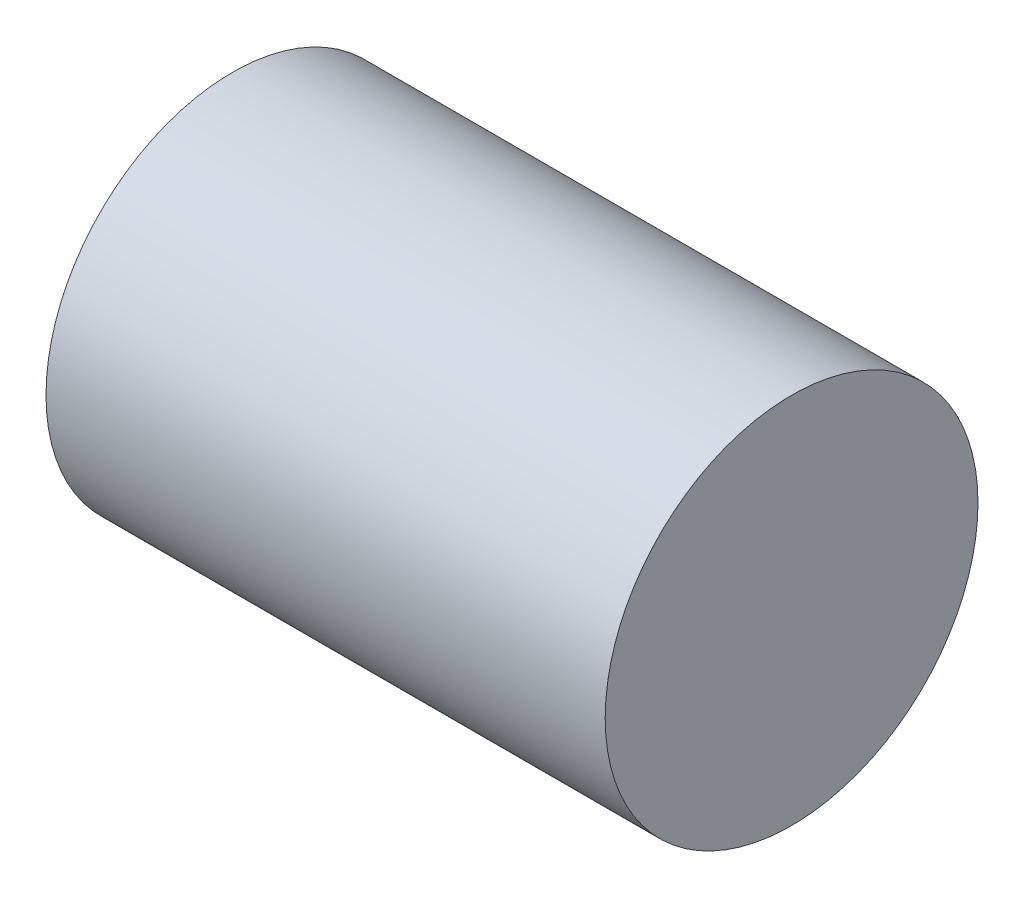
ISO-10303-21;
HEADER;
FILE_DESCRIPTION(('STEP AP214'),'2;1');
FILE_NAME('part.step','',(''),(''),'','','');
FILE_SCHEMA(('AUTOMOTIVE_DESIGN { 1 0 10303 214 1 1 1 1 }'));
ENDSEC;
DATA;
#1=APPLICATION_CONTEXT('core data for automotive mechanical design processes');
#2=APPLICATION_PROTOCOL_DEFINITION('international standard','automotive_design',2000,#1);
#3=PRODUCT_CONTEXT('',#1,'mechanical');
#4=PRODUCT('Part','Part','',(#3));
#5=PRODUCT_RELATED_PRODUCT_CATEGORY('part','',(#4));
#6=PRODUCT_DEFINITION_FORMATION('','',#4);
#7=PRODUCT_DEFINITION_CONTEXT('part definition',#1,'design');
#8=PRODUCT_DEFINITION('design','',#6,#7);
#9=PRODUCT_DEFINITION_SHAPE('','',#8);
#10=(LENGTH_UNIT() NAMED_UNIT(*) SI_UNIT(.MILLI.,.METRE.));
#11=(NAMED_UNIT(*) PLANE_ANGLE_UNIT() SI_UNIT($,.RADIAN.));
#12=(NAMED_UNIT(*) SI_UNIT($,.STERADIAN.) SOLID_ANGLE_UNIT());
#13=UNCERTAINTY_MEASURE_WITH_UNIT(LENGTH_MEASURE(1.E-05),#10,'distance_accuracy_value','');
#14=(GEOMETRIC_REPRESENTATION_CONTEXT(3) GLOBAL_UNCERTAINTY_ASSIGNED_CONTEXT((#13)) GLOBAL_UNIT_ASSIGNED_CONTEXT((#10,
#11,#12)) REPRESENTATION_CONTEXT('',''));
#15=CARTESIAN_POINT('',(0.,0.,0.));
#16=DIRECTION('',(0.,0.,1.));
#17=DIRECTION('',(1.,0.,0.));
#18=AXIS2_PLACEMENT_3D('',#15,#16,#17);
#19=CARTESIAN_POINT('',(38.1,0.,0.));
#20=DIRECTION('',(-1.,0.,0.));
#21=DIRECTION('',(0.,0.,1.));
#22=AXIS2_PLACEMENT_3D('',#19,#20,#21);
#23=CYLINDRICAL_SURFACE('',#22,12.7);
#24=CARTESIAN_POINT('',(38.1,0.,0.));
#25=DIRECTION('',(1.,0.,0.));
#26=DIRECTION('',(0.,0.,-1.));
#27=AXIS2_PLACEMENT_3D('',#24,#25,#26);
#28=CIRCLE('',#27,12.7);
#29=CARTESIAN_POINT('',(38.1,0.,12.7));
#30=VERTEX_POINT('',#29);
#31=EDGE_CURVE('E10',#30,#30,#28,.T.);
#32=CARTESIAN_POINT('',(0.,0.,0.));
#33=DIRECTION('',(1.,0.,0.));
#34=DIRECTION('',(0.,0.,-1.));
#35=AXIS2_PLACEMENT_3D('',#32,#33,#34);
#36=CIRCLE('',#35,12.7);
#37=CARTESIAN_POINT('',(0.,0.,12.7));
#38=VERTEX_POINT('',#37);
#39=EDGE_CURVE('E40',#38,#38,#36,.T.);
#40=CARTESIAN_POINT('',(38.1,0.,12.7));
#41=CARTESIAN_POINT('',(37.703125,0.,12.7));
#42=CARTESIAN_POINT('',(37.30625,0.,12.7));
#43=CARTESIAN_POINT('',(36.5125,0.,12.7));
#44=CARTESIAN_POINT('',(36.115625,0.,12.7));
#45=CARTESIAN_POINT('',(35.321875,0.,12.7));
#46=CARTESIAN_POINT('',(34.925,0.,12.7));
#47=CARTESIAN_POINT('',(34.13125,0.,12.7));
#48=CARTESIAN_POINT('',(33.734375,0.,12.7));
#49=CARTESIAN_POINT('',(32.940625,0.,12.7));
#50=CARTESIAN_POINT('',(32.54375,0.,12.7));
#51=CARTESIAN_POINT('',(31.75,0.,12.7));
#52=CARTESIAN_POINT('',(31.353125,0.,12.7));
#53=CARTESIAN_POINT('',(30.559375,0.,12.7));
#54=CARTESIAN_POINT('',(30.1625,0.,12.7));
#55=CARTESIAN_POINT('',(29.36875,0.,12.7));
#56=CARTESIAN_POINT('',(28.971875,0.,12.7));
#57=CARTESIAN_POINT('',(28.178125,0.,12.7));
#58=CARTESIAN_POINT('',(27.78125,0.,12.7));
#59=CARTESIAN_POINT('',(26.9875,0.,12.7));
#60=CARTESIAN_POINT('',(26.590625,0.,12.7));
#61=CARTESIAN_POINT('',(25.796875,0.,12.7));
#62=CARTESIAN_POINT('',(25.4,0.,12.7));
#63=CARTESIAN_POINT('',(24.60625,0.,12.7));
#64=CARTESIAN_POINT('',(24.209375,0.,12.7));
#65=CARTESIAN_POINT('',(23.415625,0.,12.7));
#66=CARTESIAN_POINT('',(23.01875,0.,12.7));
#67=CARTESIAN_POINT('',(22.225,0.,12.7));
#68=CARTESIAN_POINT('',(21.828125,0.,12.7));
#69=CARTESIAN_POINT('',(21.034375,0.,12.7));
#70=CARTESIAN_POINT('',(20.6375,0.,12.7));
#71=CARTESIAN_POINT('',(19.84375,0.,12.7));
#72=CARTESIAN_POINT('',(19.446875,0.,12.7));
#73=CARTESIAN_POINT('',(18.653125,0.,12.7));
#74=CARTESIAN_POINT('',(18.25625,0.,12.7));
#75=CARTESIAN_POINT('',(17.4625,0.,12.7));
#76=CARTESIAN_POINT('',(17.065625,0.,12.7));
#77=CARTESIAN_POINT('',(16.271875,0.,12.7));
#78=CARTESIAN_POINT('',(15.875,0.,12.7));
#79=CARTESIAN_POINT('',(15.08125,0.,12.7));
#80=CARTESIAN_POINT('',(14.684375,0.,12.7));
#81=CARTESIAN_POINT('',(13.890625,0.,12.7));
#82=CARTESIAN_POINT('',(13.49375,0.,12.7));
#83=CARTESIAN_POINT('',(12.7,0.,12.7));
#84=CARTESIAN_POINT('',(12.303125,0.,12.7));
#85=CARTESIAN_POINT('',(11.509375,0.,12.7));
#86=CARTESIAN_POINT('',(11.1125,0.,12.7));
#87=CARTESIAN_POINT('',(10.31875,0.,12.7));
#88=CARTESIAN_POINT('',(9.92187499999999,0.,12.7));
#89=CARTESIAN_POINT('',(9.128125,0.,12.7));
#90=CARTESIAN_POINT('',(8.73124999999999,0.,12.7));
#91=CARTESIAN_POINT('',(7.93749999999999,0.,12.7));
#92=CARTESIAN_POINT('',(7.54062499999999,0.,12.7));
#93=CARTESIAN_POINT('',(6.746875,0.,12.7));
#94=CARTESIAN_POINT('',(6.35,0.,12.7));
#95=CARTESIAN_POINT('',(5.55625,0.,12.7));
#96=CARTESIAN_POINT('',(5.159375,0.,12.7));
#97=CARTESIAN_POINT('',(4.365625,0.,12.7));
#98=CARTESIAN_POINT('',(3.96875,0.,12.7));
#99=CARTESIAN_POINT('',(3.175,0.,12.7));
#100=CARTESIAN_POINT('',(2.778125,0.,12.7));
#101=CARTESIAN_POINT('',(1.984375,0.,12.7));
#102=CARTESIAN_POINT('',(1.5875,0.,12.7));
#103=CARTESIAN_POINT('',(0.79375,0.,12.7));
#104=CARTESIAN_POINT('',(0.396875,0.,12.7));
#105=CARTESIAN_POINT('',(0.,0.,12.7));
#106=B_SPLINE_CURVE_WITH_KNOTS('',3,(#40,#41,#42,#43,#44,#45,#46,#47,#48,#49,#50,#51,#52,#53,
#54,#55,#56,#57,#58,#59,#60,#61,#62,#63,#64,#65,#66,#67,#68,#69,#70,#71,#72,#73,#74,#75,#76,#77,
#78,#79,#80,#81,#82,#83,#84,#85,#86,#87,#88,#89,#90,#91,#92,#93,#94,#95,#96,#97,#98,#99,#100,
#101,#102,#103,#104,#105),.UNSPECIFIED.,.F.,.F.,(4,2,2,2,2,2,2,2,2,2,2,2,2,2,2,2,2,2,2,2,2,2,2,
2,2,2,2,2,2,2,2,2,4),(0.,1.190625,2.38125,3.571875,4.7625,5.953125,7.14375,8.334375,
9.52500000000001,10.715625,11.90625,13.096875,14.2875,15.478125,16.66875,17.859375,19.05,
20.240625,21.43125,22.621875,23.8125,25.003125,26.19375,27.384375,28.575,29.765625,30.95625,
32.146875,33.3375,34.528125,35.71875,36.909375,38.1),.UNSPECIFIED.);
#107=EDGE_CURVE('BSEAM37',#30,#38,#106,.T.);
#108=ORIENTED_EDGE('',*,*,#31,.F.);
#109=ORIENTED_EDGE('',*,*,#39,.T.);
#110=ORIENTED_EDGE('',*,*,#107,.T.);
#111=ORIENTED_EDGE('',*,*,#107,.F.);
#112=EDGE_LOOP('',(#108,#110,#109,#111));
#113=FACE_BOUND('',#112,.T.);
#114=ADVANCED_FACE('F37',(#113),#23,.T.);
#115=CARTESIAN_POINT('',(38.1,0.,0.));
#116=DIRECTION('',(1.,0.,0.));
#117=DIRECTION('',(0.,0.,-1.));
#118=AXIS2_PLACEMENT_3D('',#115,#116,#117);
#119=PLANE('',#118);
#120=ORIENTED_EDGE('',*,*,#31,.T.);
#121=EDGE_LOOP('',(#120));
#122=FACE_BOUND('',#121,.T.);
#123=ADVANCED_FACE('F54',(#122),#119,.T.);
#124=CARTESIAN_POINT('',(0.,0.,0.));
#125=DIRECTION('',(1.,0.,0.));
#126=DIRECTION('',(0.,0.,-1.));
#127=AXIS2_PLACEMENT_3D('',#124,#125,#126);
#128=PLANE('',#127);
#129=ORIENTED_EDGE('',*,*,#39,.F.);
#130=EDGE_LOOP('',(#129));
#131=FACE_BOUND('',#130,.T.);
#132=ADVANCED_FACE('F52',(#131),#128,.F.);
#133=CLOSED_SHELL('',(#114,#123,#132));
#134=MANIFOLD_SOLID_BREP('B2',#133);
#135=ADVANCED_BREP_SHAPE_REPRESENTATION('',(#18,#134),#14);
#136=SHAPE_DEFINITION_REPRESENTATION(#9,#135);
ENDSEC;
END-ISO-10303-21;
